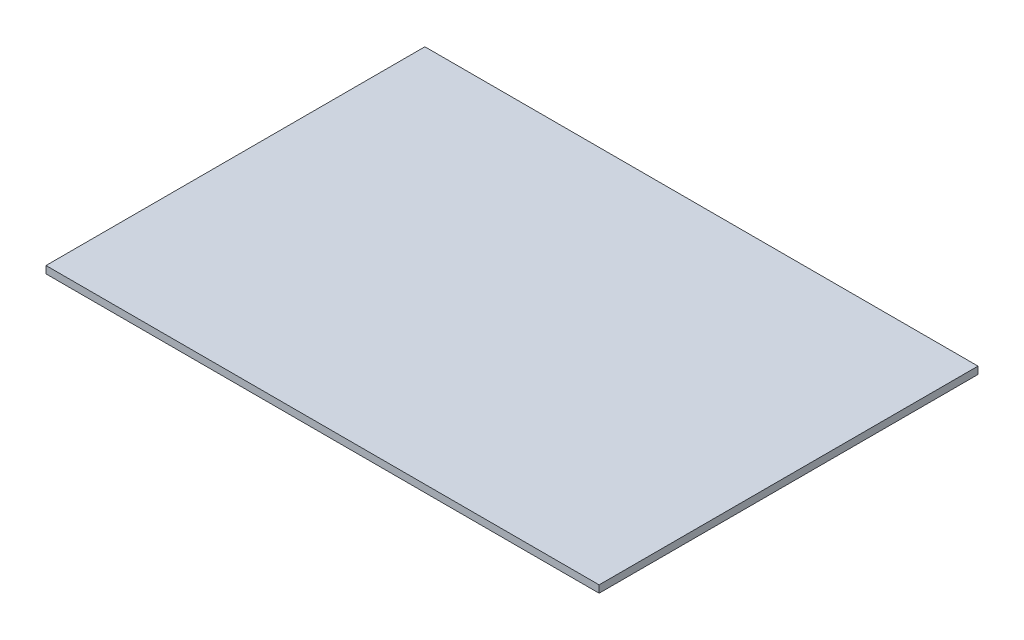
ISO-10303-21;
HEADER;
FILE_DESCRIPTION(('STEP AP214'),'2;1');
FILE_NAME('part.step','',(''),(''),'','','');
FILE_SCHEMA(('AUTOMOTIVE_DESIGN { 1 0 10303 214 1 1 1 1 }'));
ENDSEC;
DATA;
#1=APPLICATION_CONTEXT('core data for automotive mechanical design processes');
#2=APPLICATION_PROTOCOL_DEFINITION('international standard','automotive_design',2000,#1);
#3=PRODUCT_CONTEXT('',#1,'mechanical');
#4=PRODUCT('Part','Part','',(#3));
#5=PRODUCT_RELATED_PRODUCT_CATEGORY('part','',(#4));
#6=PRODUCT_DEFINITION_FORMATION('','',#4);
#7=PRODUCT_DEFINITION_CONTEXT('part definition',#1,'design');
#8=PRODUCT_DEFINITION('design','',#6,#7);
#9=PRODUCT_DEFINITION_SHAPE('','',#8);
#10=(LENGTH_UNIT() NAMED_UNIT(*) SI_UNIT(.MILLI.,.METRE.));
#11=(NAMED_UNIT(*) PLANE_ANGLE_UNIT() SI_UNIT($,.RADIAN.));
#12=(NAMED_UNIT(*) SI_UNIT($,.STERADIAN.) SOLID_ANGLE_UNIT());
#13=UNCERTAINTY_MEASURE_WITH_UNIT(LENGTH_MEASURE(1.E-05),#10,'distance_accuracy_value','');
#14=(GEOMETRIC_REPRESENTATION_CONTEXT(3) GLOBAL_UNCERTAINTY_ASSIGNED_CONTEXT((#13)) GLOBAL_UNIT_ASSIGNED_CONTEXT((#10,
#11,#12)) REPRESENTATION_CONTEXT('',''));
#15=CARTESIAN_POINT('',(0.,0.,0.));
#16=DIRECTION('',(0.,0.,1.));
#17=DIRECTION('',(1.,0.,0.));
#18=AXIS2_PLACEMENT_3D('',#15,#16,#17);
#19=CARTESIAN_POINT('',(482.6,12.7,330.585));
#20=DIRECTION('',(-1.,0.,0.));
#21=DIRECTION('',(0.,0.,1.));
#22=AXIS2_PLACEMENT_3D('',#19,#20,#21);
#23=PLANE('',#22);
#24=DIRECTION('',(0.,0.,-1.));
#25=VECTOR('',#24,1.);
#26=CARTESIAN_POINT('',(482.6,0.,330.585));
#27=LINE('',#26,#25);
#28=CARTESIAN_POINT('',(482.6,0.,330.585));
#29=VERTEX_POINT('',#28);
#30=CARTESIAN_POINT('',(482.6,0.,-330.585));
#31=VERTEX_POINT('',#30);
#32=EDGE_CURVE('E100',#29,#31,#27,.T.);
#33=ORIENTED_EDGE('',*,*,#32,.T.);
#34=DIRECTION('',(0.,-1.,0.));
#35=VECTOR('',#34,1.);
#36=CARTESIAN_POINT('',(482.6,12.7,-330.585));
#37=LINE('',#36,#35);
#38=CARTESIAN_POINT('',(482.6,12.7,-330.585));
#39=VERTEX_POINT('',#38);
#40=EDGE_CURVE('E11',#39,#31,#37,.T.);
#41=ORIENTED_EDGE('',*,*,#40,.F.);
#42=DIRECTION('',(0.,0.,-1.));
#43=VECTOR('',#42,1.);
#44=CARTESIAN_POINT('',(482.6,12.7,330.585));
#45=LINE('',#44,#43);
#46=CARTESIAN_POINT('',(482.6,12.7,330.585));
#47=VERTEX_POINT('',#46);
#48=EDGE_CURVE('E88',#47,#39,#45,.T.);
#49=ORIENTED_EDGE('',*,*,#48,.F.);
#50=DIRECTION('',(0.,-1.,0.));
#51=VECTOR('',#50,1.);
#52=CARTESIAN_POINT('',(482.6,12.7,330.585));
#53=LINE('',#52,#51);
#54=EDGE_CURVE('E96',#47,#29,#53,.T.);
#55=ORIENTED_EDGE('',*,*,#54,.T.);
#56=EDGE_LOOP('',(#33,#41,#49,#55));
#57=FACE_BOUND('',#56,.T.);
#58=ADVANCED_FACE('F37',(#57),#23,.F.);
#59=CARTESIAN_POINT('',(-482.6,12.7,-330.585));
#60=DIRECTION('',(0.,0.,1.));
#61=DIRECTION('',(1.,0.,0.));
#62=AXIS2_PLACEMENT_3D('',#59,#60,#61);
#63=PLANE('',#62);
#64=DIRECTION('',(-1.,0.,0.));
#65=VECTOR('',#64,1.);
#66=CARTESIAN_POINT('',(-482.6,0.,-330.585));
#67=LINE('',#66,#65);
#68=CARTESIAN_POINT('',(-482.6,0.,-330.585));
#69=VERTEX_POINT('',#68);
#70=EDGE_CURVE('E92',#31,#69,#67,.T.);
#71=ORIENTED_EDGE('',*,*,#70,.T.);
#72=DIRECTION('',(0.,-1.,0.));
#73=VECTOR('',#72,1.);
#74=CARTESIAN_POINT('',(-482.6,12.7,-330.585));
#75=LINE('',#74,#73);
#76=CARTESIAN_POINT('',(-482.6,12.7,-330.585));
#77=VERTEX_POINT('',#76);
#78=EDGE_CURVE('E45',#77,#69,#75,.T.);
#79=ORIENTED_EDGE('',*,*,#78,.F.);
#80=DIRECTION('',(-1.,0.,0.));
#81=VECTOR('',#80,1.);
#82=CARTESIAN_POINT('',(-482.6,12.7,-330.585));
#83=LINE('',#82,#81);
#84=EDGE_CURVE('E83',#39,#77,#83,.T.);
#85=ORIENTED_EDGE('',*,*,#84,.F.);
#86=ORIENTED_EDGE('',*,*,#40,.T.);
#87=EDGE_LOOP('',(#71,#79,#85,#86));
#88=FACE_BOUND('',#87,.T.);
#89=ADVANCED_FACE('F91',(#88),#63,.F.);
#90=CARTESIAN_POINT('',(-482.6,12.7,330.585));
#91=DIRECTION('',(1.,0.,0.));
#92=DIRECTION('',(0.,0.,-1.));
#93=AXIS2_PLACEMENT_3D('',#90,#91,#92);
#94=PLANE('',#93);
#95=DIRECTION('',(0.,0.,1.));
#96=VECTOR('',#95,1.);
#97=CARTESIAN_POINT('',(-482.6,0.,330.585));
#98=LINE('',#97,#96);
#99=CARTESIAN_POINT('',(-482.6,0.,330.585));
#100=VERTEX_POINT('',#99);
#101=EDGE_CURVE('E70',#69,#100,#98,.T.);
#102=ORIENTED_EDGE('',*,*,#101,.T.);
#103=DIRECTION('',(0.,-1.,0.));
#104=VECTOR('',#103,1.);
#105=CARTESIAN_POINT('',(-482.6,12.7,330.585));
#106=LINE('',#105,#104);
#107=CARTESIAN_POINT('',(-482.6,12.7,330.585));
#108=VERTEX_POINT('',#107);
#109=EDGE_CURVE('E93',#108,#100,#106,.T.);
#110=ORIENTED_EDGE('',*,*,#109,.F.);
#111=DIRECTION('',(0.,0.,1.));
#112=VECTOR('',#111,1.);
#113=CARTESIAN_POINT('',(-482.6,12.7,330.585));
#114=LINE('',#113,#112);
#115=EDGE_CURVE('E86',#77,#108,#114,.T.);
#116=ORIENTED_EDGE('',*,*,#115,.F.);
#117=ORIENTED_EDGE('',*,*,#78,.T.);
#118=EDGE_LOOP('',(#102,#110,#116,#117));
#119=FACE_BOUND('',#118,.T.);
#120=ADVANCED_FACE('F94',(#119),#94,.F.);
#121=CARTESIAN_POINT('',(-482.6,12.7,330.585));
#122=DIRECTION('',(0.,0.,-1.));
#123=DIRECTION('',(-1.,0.,0.));
#124=AXIS2_PLACEMENT_3D('',#121,#122,#123);
#125=PLANE('',#124);
#126=DIRECTION('',(1.,0.,0.));
#127=VECTOR('',#126,1.);
#128=CARTESIAN_POINT('',(-482.6,0.,330.585));
#129=LINE('',#128,#127);
#130=EDGE_CURVE('E76',#100,#29,#129,.T.);
#131=ORIENTED_EDGE('',*,*,#130,.T.);
#132=ORIENTED_EDGE('',*,*,#54,.F.);
#133=DIRECTION('',(1.,0.,0.));
#134=VECTOR('',#133,1.);
#135=CARTESIAN_POINT('',(-482.6,12.7,330.585));
#136=LINE('',#135,#134);
#137=EDGE_CURVE('E53',#108,#47,#136,.T.);
#138=ORIENTED_EDGE('',*,*,#137,.F.);
#139=ORIENTED_EDGE('',*,*,#109,.T.);
#140=EDGE_LOOP('',(#131,#132,#138,#139));
#141=FACE_BOUND('',#140,.T.);
#142=ADVANCED_FACE('F107',(#141),#125,.F.);
#143=CARTESIAN_POINT('',(0.,12.7,0.));
#144=DIRECTION('',(0.,-1.,0.));
#145=DIRECTION('',(0.,0.,-1.));
#146=AXIS2_PLACEMENT_3D('',#143,#144,#145);
#147=PLANE('',#146);
#148=ORIENTED_EDGE('',*,*,#48,.T.);
#149=ORIENTED_EDGE('',*,*,#84,.T.);
#150=ORIENTED_EDGE('',*,*,#115,.T.);
#151=ORIENTED_EDGE('',*,*,#137,.T.);
#152=EDGE_LOOP('',(#148,#149,#150,#151));
#153=FACE_BOUND('',#152,.T.);
#154=ADVANCED_FACE('F84',(#153),#147,.F.);
#155=CARTESIAN_POINT('',(0.,0.,0.));
#156=DIRECTION('',(0.,-1.,0.));
#157=DIRECTION('',(0.,0.,-1.));
#158=AXIS2_PLACEMENT_3D('',#155,#156,#157);
#159=PLANE('',#158);
#160=ORIENTED_EDGE('',*,*,#32,.F.);
#161=ORIENTED_EDGE('',*,*,#130,.F.);
#162=ORIENTED_EDGE('',*,*,#101,.F.);
#163=ORIENTED_EDGE('',*,*,#70,.F.);
#164=EDGE_LOOP('',(#160,#161,#162,#163));
#165=FACE_BOUND('',#164,.T.);
#166=ADVANCED_FACE('F110',(#165),#159,.T.);
#167=CLOSED_SHELL('',(#58,#89,#120,#142,#154,#166));
#168=MANIFOLD_SOLID_BREP('B2',#167);
#169=ADVANCED_BREP_SHAPE_REPRESENTATION('',(#18,#168),#14);
#170=SHAPE_DEFINITION_REPRESENTATION(#9,#169);
ENDSEC;
END-ISO-10303-21;
